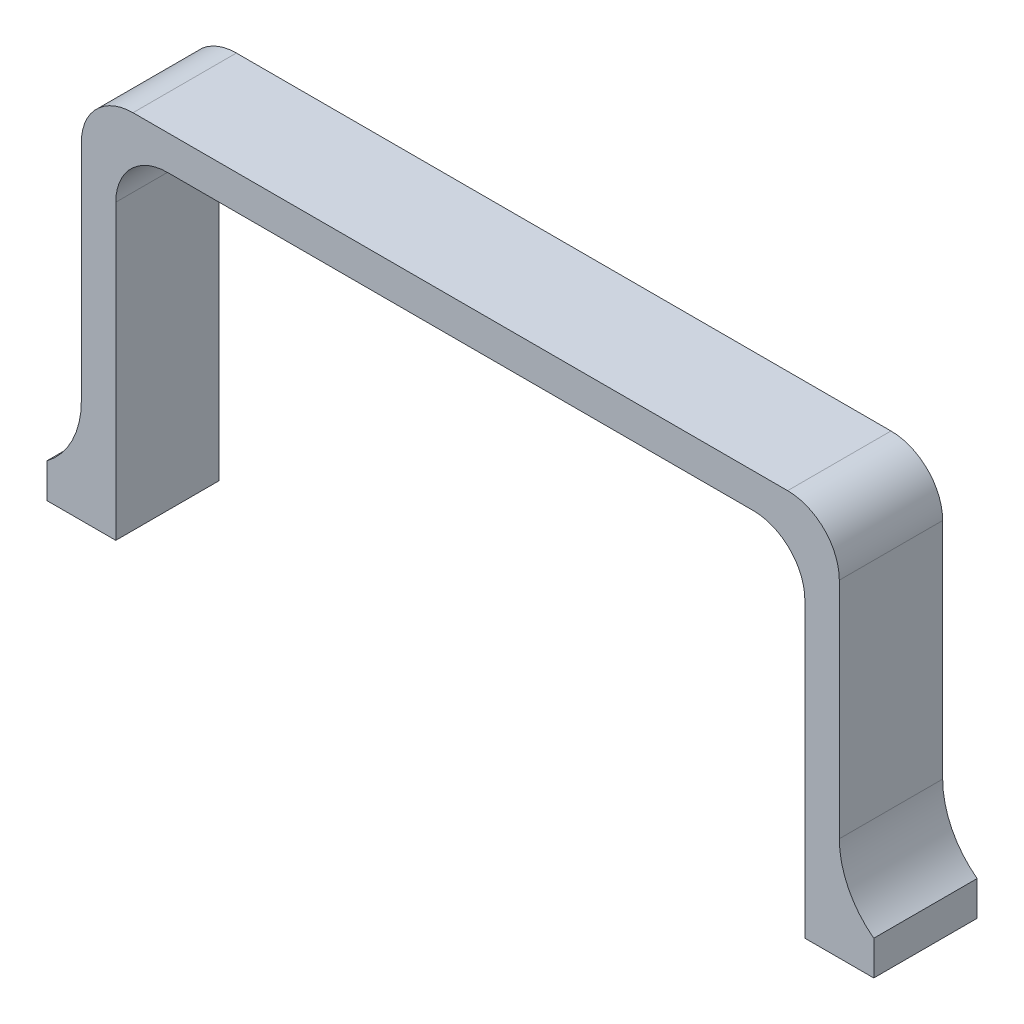
ISO-10303-21;
HEADER;
FILE_DESCRIPTION(('STEP AP214'),'2;1');
FILE_NAME('part.step','',(''),(''),'','','');
FILE_SCHEMA(('AUTOMOTIVE_DESIGN { 1 0 10303 214 1 1 1 1 }'));
ENDSEC;
DATA;
#1=APPLICATION_CONTEXT('core data for automotive mechanical design processes');
#2=APPLICATION_PROTOCOL_DEFINITION('international standard','automotive_design',2000,#1);
#3=PRODUCT_CONTEXT('',#1,'mechanical');
#4=PRODUCT('Part','Part','',(#3));
#5=PRODUCT_RELATED_PRODUCT_CATEGORY('part','',(#4));
#6=PRODUCT_DEFINITION_FORMATION('','',#4);
#7=PRODUCT_DEFINITION_CONTEXT('part definition',#1,'design');
#8=PRODUCT_DEFINITION('design','',#6,#7);
#9=PRODUCT_DEFINITION_SHAPE('','',#8);
#10=(LENGTH_UNIT() NAMED_UNIT(*) SI_UNIT(.MILLI.,.METRE.));
#11=(NAMED_UNIT(*) PLANE_ANGLE_UNIT() SI_UNIT($,.RADIAN.));
#12=(NAMED_UNIT(*) SI_UNIT($,.STERADIAN.) SOLID_ANGLE_UNIT());
#13=UNCERTAINTY_MEASURE_WITH_UNIT(LENGTH_MEASURE(1.E-05),#10,'distance_accuracy_value','');
#14=(GEOMETRIC_REPRESENTATION_CONTEXT(3) GLOBAL_UNCERTAINTY_ASSIGNED_CONTEXT((#13)) GLOBAL_UNIT_ASSIGNED_CONTEXT((#10,
#11,#12)) REPRESENTATION_CONTEXT('',''));
#15=CARTESIAN_POINT('',(0.,0.,0.));
#16=DIRECTION('',(0.,0.,1.));
#17=DIRECTION('',(1.,0.,0.));
#18=AXIS2_PLACEMENT_3D('',#15,#16,#17);
#19=CARTESIAN_POINT('',(20.,0.,6.));
#20=DIRECTION('',(1.,0.,0.));
#21=DIRECTION('',(0.,1.,0.));
#22=AXIS2_PLACEMENT_3D('',#19,#20,#21);
#23=PLANE('',#22);
#24=DIRECTION('',(0.,-1.,0.));
#25=VECTOR('',#24,1.);
#26=CARTESIAN_POINT('',(20.,0.,6.));
#27=LINE('',#26,#25);
#28=CARTESIAN_POINT('',(20.,-3.,6.));
#29=VERTEX_POINT('',#28);
#30=CARTESIAN_POINT('',(20.,-20.,6.));
#31=VERTEX_POINT('',#30);
#32=EDGE_CURVE('E150',#29,#31,#27,.T.);
#33=ORIENTED_EDGE('',*,*,#32,.F.);
#34=DIRECTION('',(0.,0.,-1.));
#35=VECTOR('',#34,1.);
#36=CARTESIAN_POINT('',(20.,-3.,0.));
#37=LINE('',#36,#35);
#38=CARTESIAN_POINT('',(20.,-3.,0.));
#39=VERTEX_POINT('',#38);
#40=EDGE_CURVE('E228',#29,#39,#37,.T.);
#41=ORIENTED_EDGE('',*,*,#40,.T.);
#42=DIRECTION('',(0.,-1.,0.));
#43=VECTOR('',#42,1.);
#44=CARTESIAN_POINT('',(20.,0.,0.));
#45=LINE('',#44,#43);
#46=CARTESIAN_POINT('',(20.,-20.,0.));
#47=VERTEX_POINT('',#46);
#48=EDGE_CURVE('E176',#39,#47,#45,.T.);
#49=ORIENTED_EDGE('',*,*,#48,.T.);
#50=DIRECTION('',(0.,0.,-1.));
#51=VECTOR('',#50,1.);
#52=CARTESIAN_POINT('',(20.,-20.,6.));
#53=LINE('',#52,#51);
#54=EDGE_CURVE('E168',#31,#47,#53,.T.);
#55=ORIENTED_EDGE('',*,*,#54,.F.);
#56=EDGE_LOOP('',(#33,#41,#49,#55));
#57=FACE_BOUND('',#56,.T.);
#58=ADVANCED_FACE('F38',(#57),#23,.F.);
#59=CARTESIAN_POINT('',(20.,-20.,6.));
#60=DIRECTION('',(0.,1.,0.));
#61=DIRECTION('',(0.,0.,1.));
#62=AXIS2_PLACEMENT_3D('',#59,#60,#61);
#63=PLANE('',#62);
#64=DIRECTION('',(1.,0.,0.));
#65=VECTOR('',#64,1.);
#66=CARTESIAN_POINT('',(20.,-20.,0.));
#67=LINE('',#66,#65);
#68=CARTESIAN_POINT('',(24.,-20.,0.));
#69=VERTEX_POINT('',#68);
#70=EDGE_CURVE('E285',#47,#69,#67,.T.);
#71=ORIENTED_EDGE('',*,*,#70,.T.);
#72=DIRECTION('',(0.,0.,-1.));
#73=VECTOR('',#72,1.);
#74=CARTESIAN_POINT('',(24.,-20.,6.));
#75=LINE('',#74,#73);
#76=CARTESIAN_POINT('',(24.,-20.,6.));
#77=VERTEX_POINT('',#76);
#78=EDGE_CURVE('E170',#77,#69,#75,.T.);
#79=ORIENTED_EDGE('',*,*,#78,.F.);
#80=DIRECTION('',(1.,0.,0.));
#81=VECTOR('',#80,1.);
#82=CARTESIAN_POINT('',(20.,-20.,6.));
#83=LINE('',#82,#81);
#84=EDGE_CURVE('E154',#31,#77,#83,.T.);
#85=ORIENTED_EDGE('',*,*,#84,.F.);
#86=ORIENTED_EDGE('',*,*,#54,.T.);
#87=EDGE_LOOP('',(#71,#79,#85,#86));
#88=FACE_BOUND('',#87,.T.);
#89=ADVANCED_FACE('F167',(#88),#63,.F.);
#90=CARTESIAN_POINT('',(24.,-20.,6.));
#91=DIRECTION('',(-1.,0.,0.));
#92=DIRECTION('',(0.,0.,1.));
#93=AXIS2_PLACEMENT_3D('',#90,#91,#92);
#94=PLANE('',#93);
#95=DIRECTION('',(0.,1.,0.));
#96=VECTOR('',#95,1.);
#97=CARTESIAN_POINT('',(24.,-20.,0.));
#98=LINE('',#97,#96);
#99=CARTESIAN_POINT('',(24.,-18.,0.));
#100=VERTEX_POINT('',#99);
#101=EDGE_CURVE('E288',#69,#100,#98,.T.);
#102=ORIENTED_EDGE('',*,*,#101,.T.);
#103=DIRECTION('',(0.,0.,-1.));
#104=VECTOR('',#103,1.);
#105=CARTESIAN_POINT('',(24.,-18.,6.));
#106=LINE('',#105,#104);
#107=CARTESIAN_POINT('',(24.,-18.,6.));
#108=VERTEX_POINT('',#107);
#109=EDGE_CURVE('E186',#108,#100,#106,.T.);
#110=ORIENTED_EDGE('',*,*,#109,.F.);
#111=DIRECTION('',(0.,1.,0.));
#112=VECTOR('',#111,1.);
#113=CARTESIAN_POINT('',(24.,-20.,6.));
#114=LINE('',#113,#112);
#115=EDGE_CURVE('E173',#77,#108,#114,.T.);
#116=ORIENTED_EDGE('',*,*,#115,.F.);
#117=ORIENTED_EDGE('',*,*,#78,.T.);
#118=EDGE_LOOP('',(#102,#110,#116,#117));
#119=FACE_BOUND('',#118,.T.);
#120=ADVANCED_FACE('F324',(#119),#94,.F.);
#121=CARTESIAN_POINT('',(22.,-18.,6.));
#122=DIRECTION('',(-1.,0.,0.));
#123=DIRECTION('',(0.,0.,1.));
#124=AXIS2_PLACEMENT_3D('',#121,#122,#123);
#125=PLANE('',#124);
#126=DIRECTION('',(0.,1.,0.));
#127=VECTOR('',#126,1.);
#128=CARTESIAN_POINT('',(22.,-18.,0.));
#129=LINE('',#128,#127);
#130=CARTESIAN_POINT('',(22.,-14.,0.));
#131=VERTEX_POINT('',#130);
#132=CARTESIAN_POINT('',(22.,-0.999999999999997,0.));
#133=VERTEX_POINT('',#132);
#134=EDGE_CURVE('E292',#131,#133,#129,.T.);
#135=ORIENTED_EDGE('',*,*,#134,.T.);
#136=DIRECTION('',(0.,0.,-1.));
#137=VECTOR('',#136,1.);
#138=CARTESIAN_POINT('',(22.,-0.999999999999997,6.));
#139=LINE('',#138,#137);
#140=CARTESIAN_POINT('',(22.,-0.999999999999997,6.));
#141=VERTEX_POINT('',#140);
#142=EDGE_CURVE('E219',#133,#141,#139,.F.);
#143=ORIENTED_EDGE('',*,*,#142,.T.);
#144=DIRECTION('',(0.,1.,0.));
#145=VECTOR('',#144,1.);
#146=CARTESIAN_POINT('',(22.,-18.,6.));
#147=LINE('',#146,#145);
#148=CARTESIAN_POINT('',(22.,-14.,6.));
#149=VERTEX_POINT('',#148);
#150=EDGE_CURVE('E339',#149,#141,#147,.T.);
#151=ORIENTED_EDGE('',*,*,#150,.F.);
#152=DIRECTION('',(0.,0.,-1.));
#153=VECTOR('',#152,1.);
#154=CARTESIAN_POINT('',(22.,-14.,6.));
#155=LINE('',#154,#153);
#156=EDGE_CURVE('E179',#149,#131,#155,.T.);
#157=ORIENTED_EDGE('',*,*,#156,.T.);
#158=EDGE_LOOP('',(#135,#143,#151,#157));
#159=FACE_BOUND('',#158,.T.);
#160=ADVANCED_FACE('F329',(#159),#125,.F.);
#161=CARTESIAN_POINT('',(22.,2.,6.));
#162=DIRECTION('',(0.,-1.,0.));
#163=DIRECTION('',(1.,0.,0.));
#164=AXIS2_PLACEMENT_3D('',#161,#162,#163);
#165=PLANE('',#164);
#166=DIRECTION('',(-1.,0.,0.));
#167=VECTOR('',#166,1.);
#168=CARTESIAN_POINT('',(22.,2.,6.));
#169=LINE('',#168,#167);
#170=CARTESIAN_POINT('',(19.,2.,6.));
#171=VERTEX_POINT('',#170);
#172=CARTESIAN_POINT('',(-19.,2.,6.));
#173=VERTEX_POINT('',#172);
#174=EDGE_CURVE('E337',#171,#173,#169,.T.);
#175=ORIENTED_EDGE('',*,*,#174,.F.);
#176=DIRECTION('',(0.,0.,-1.));
#177=VECTOR('',#176,1.);
#178=CARTESIAN_POINT('',(19.,2.,6.));
#179=LINE('',#178,#177);
#180=CARTESIAN_POINT('',(19.,2.,0.));
#181=VERTEX_POINT('',#180);
#182=EDGE_CURVE('E209',#171,#181,#179,.T.);
#183=ORIENTED_EDGE('',*,*,#182,.T.);
#184=DIRECTION('',(-1.,0.,0.));
#185=VECTOR('',#184,1.);
#186=CARTESIAN_POINT('',(22.,2.,0.));
#187=LINE('',#186,#185);
#188=CARTESIAN_POINT('',(-19.,2.,0.));
#189=VERTEX_POINT('',#188);
#190=EDGE_CURVE('E296',#181,#189,#187,.T.);
#191=ORIENTED_EDGE('',*,*,#190,.T.);
#192=DIRECTION('',(0.,0.,-1.));
#193=VECTOR('',#192,1.);
#194=CARTESIAN_POINT('',(-19.,2.,6.));
#195=LINE('',#194,#193);
#196=EDGE_CURVE('E206',#189,#173,#195,.F.);
#197=ORIENTED_EDGE('',*,*,#196,.T.);
#198=EDGE_LOOP('',(#175,#183,#191,#197));
#199=FACE_BOUND('',#198,.T.);
#200=ADVANCED_FACE('F341',(#199),#165,.F.);
#201=CARTESIAN_POINT('',(-22.,-18.,6.));
#202=DIRECTION('',(1.,0.,0.));
#203=DIRECTION('',(0.,1.,0.));
#204=AXIS2_PLACEMENT_3D('',#201,#202,#203);
#205=PLANE('',#204);
#206=DIRECTION('',(0.,-1.,0.));
#207=VECTOR('',#206,1.);
#208=CARTESIAN_POINT('',(-22.,-18.,6.));
#209=LINE('',#208,#207);
#210=CARTESIAN_POINT('',(-22.,-1.,6.));
#211=VERTEX_POINT('',#210);
#212=CARTESIAN_POINT('',(-22.,-14.,6.));
#213=VERTEX_POINT('',#212);
#214=EDGE_CURVE('E344',#211,#213,#209,.T.);
#215=ORIENTED_EDGE('',*,*,#214,.F.);
#216=DIRECTION('',(0.,0.,-1.));
#217=VECTOR('',#216,1.);
#218=CARTESIAN_POINT('',(-22.,-1.,6.));
#219=LINE('',#218,#217);
#220=CARTESIAN_POINT('',(-22.,-1.,0.));
#221=VERTEX_POINT('',#220);
#222=EDGE_CURVE('E240',#211,#221,#219,.T.);
#223=ORIENTED_EDGE('',*,*,#222,.T.);
#224=DIRECTION('',(0.,-1.,0.));
#225=VECTOR('',#224,1.);
#226=CARTESIAN_POINT('',(-22.,-18.,0.));
#227=LINE('',#226,#225);
#228=CARTESIAN_POINT('',(-22.,-14.,0.));
#229=VERTEX_POINT('',#228);
#230=EDGE_CURVE('E300',#221,#229,#227,.T.);
#231=ORIENTED_EDGE('',*,*,#230,.T.);
#232=DIRECTION('',(0.,0.,1.));
#233=VECTOR('',#232,1.);
#234=CARTESIAN_POINT('',(-22.,-14.,6.));
#235=LINE('',#234,#233);
#236=EDGE_CURVE('E184',#229,#213,#235,.T.);
#237=ORIENTED_EDGE('',*,*,#236,.T.);
#238=EDGE_LOOP('',(#215,#223,#231,#237));
#239=FACE_BOUND('',#238,.T.);
#240=ADVANCED_FACE('F371',(#239),#205,.F.);
#241=CARTESIAN_POINT('',(-24.,-20.,6.));
#242=DIRECTION('',(1.,0.,0.));
#243=DIRECTION('',(0.,0.,-1.));
#244=AXIS2_PLACEMENT_3D('',#241,#242,#243);
#245=PLANE('',#244);
#246=DIRECTION('',(0.,-1.,0.));
#247=VECTOR('',#246,1.);
#248=CARTESIAN_POINT('',(-24.,-20.,0.));
#249=LINE('',#248,#247);
#250=CARTESIAN_POINT('',(-24.,-18.,0.));
#251=VERTEX_POINT('',#250);
#252=CARTESIAN_POINT('',(-24.,-20.,0.));
#253=VERTEX_POINT('',#252);
#254=EDGE_CURVE('E303',#251,#253,#249,.T.);
#255=ORIENTED_EDGE('',*,*,#254,.T.);
#256=DIRECTION('',(0.,0.,-1.));
#257=VECTOR('',#256,1.);
#258=CARTESIAN_POINT('',(-24.,-20.,6.));
#259=LINE('',#258,#257);
#260=CARTESIAN_POINT('',(-24.,-20.,6.));
#261=VERTEX_POINT('',#260);
#262=EDGE_CURVE('E277',#261,#253,#259,.T.);
#263=ORIENTED_EDGE('',*,*,#262,.F.);
#264=DIRECTION('',(0.,-1.,0.));
#265=VECTOR('',#264,1.);
#266=CARTESIAN_POINT('',(-24.,-20.,6.));
#267=LINE('',#266,#265);
#268=CARTESIAN_POINT('',(-24.,-18.,6.));
#269=VERTEX_POINT('',#268);
#270=EDGE_CURVE('E348',#269,#261,#267,.T.);
#271=ORIENTED_EDGE('',*,*,#270,.F.);
#272=DIRECTION('',(0.,0.,-1.));
#273=VECTOR('',#272,1.);
#274=CARTESIAN_POINT('',(-24.,-18.,6.));
#275=LINE('',#274,#273);
#276=EDGE_CURVE('E313',#269,#251,#275,.T.);
#277=ORIENTED_EDGE('',*,*,#276,.T.);
#278=EDGE_LOOP('',(#255,#263,#271,#277));
#279=FACE_BOUND('',#278,.T.);
#280=ADVANCED_FACE('F364',(#279),#245,.F.);
#281=CARTESIAN_POINT('',(-20.,-20.,6.));
#282=DIRECTION('',(0.,1.,0.));
#283=DIRECTION('',(-1.,0.,0.));
#284=AXIS2_PLACEMENT_3D('',#281,#282,#283);
#285=PLANE('',#284);
#286=DIRECTION('',(1.,0.,0.));
#287=VECTOR('',#286,1.);
#288=CARTESIAN_POINT('',(-20.,-20.,0.));
#289=LINE('',#288,#287);
#290=CARTESIAN_POINT('',(-20.,-20.,0.));
#291=VERTEX_POINT('',#290);
#292=EDGE_CURVE('E267',#253,#291,#289,.T.);
#293=ORIENTED_EDGE('',*,*,#292,.T.);
#294=DIRECTION('',(0.,0.,-1.));
#295=VECTOR('',#294,1.);
#296=CARTESIAN_POINT('',(-20.,-20.,6.));
#297=LINE('',#296,#295);
#298=CARTESIAN_POINT('',(-20.,-20.,6.));
#299=VERTEX_POINT('',#298);
#300=EDGE_CURVE('E265',#299,#291,#297,.T.);
#301=ORIENTED_EDGE('',*,*,#300,.F.);
#302=DIRECTION('',(1.,0.,0.));
#303=VECTOR('',#302,1.);
#304=CARTESIAN_POINT('',(-20.,-20.,6.));
#305=LINE('',#304,#303);
#306=EDGE_CURVE('E279',#261,#299,#305,.T.);
#307=ORIENTED_EDGE('',*,*,#306,.F.);
#308=ORIENTED_EDGE('',*,*,#262,.T.);
#309=EDGE_LOOP('',(#293,#301,#307,#308));
#310=FACE_BOUND('',#309,.T.);
#311=ADVANCED_FACE('F359',(#310),#285,.F.);
#312=CARTESIAN_POINT('',(-20.,0.,6.));
#313=DIRECTION('',(-1.,0.,0.));
#314=DIRECTION('',(0.,-1.,0.));
#315=AXIS2_PLACEMENT_3D('',#312,#313,#314);
#316=PLANE('',#315);
#317=DIRECTION('',(0.,1.,0.));
#318=VECTOR('',#317,1.);
#319=CARTESIAN_POINT('',(-20.,0.,0.));
#320=LINE('',#319,#318);
#321=CARTESIAN_POINT('',(-20.,-3.,0.));
#322=VERTEX_POINT('',#321);
#323=EDGE_CURVE('E256',#291,#322,#320,.T.);
#324=ORIENTED_EDGE('',*,*,#323,.T.);
#325=DIRECTION('',(0.,0.,-1.));
#326=VECTOR('',#325,1.);
#327=CARTESIAN_POINT('',(-20.,-3.,6.));
#328=LINE('',#327,#326);
#329=CARTESIAN_POINT('',(-20.,-3.,6.));
#330=VERTEX_POINT('',#329);
#331=EDGE_CURVE('E237',#322,#330,#328,.F.);
#332=ORIENTED_EDGE('',*,*,#331,.T.);
#333=DIRECTION('',(0.,1.,0.));
#334=VECTOR('',#333,1.);
#335=CARTESIAN_POINT('',(-20.,0.,6.));
#336=LINE('',#335,#334);
#337=EDGE_CURVE('E273',#299,#330,#336,.T.);
#338=ORIENTED_EDGE('',*,*,#337,.F.);
#339=ORIENTED_EDGE('',*,*,#300,.T.);
#340=EDGE_LOOP('',(#324,#332,#338,#339));
#341=FACE_BOUND('',#340,.T.);
#342=ADVANCED_FACE('F262',(#341),#316,.F.);
#343=CARTESIAN_POINT('',(-20.,0.,6.));
#344=DIRECTION('',(0.,1.,0.));
#345=DIRECTION('',(0.,0.,1.));
#346=AXIS2_PLACEMENT_3D('',#343,#344,#345);
#347=PLANE('',#346);
#348=DIRECTION('',(1.,0.,0.));
#349=VECTOR('',#348,1.);
#350=CARTESIAN_POINT('',(-20.,0.,0.));
#351=LINE('',#350,#349);
#352=CARTESIAN_POINT('',(-17.,0.,0.));
#353=VERTEX_POINT('',#352);
#354=CARTESIAN_POINT('',(17.,0.,0.));
#355=VERTEX_POINT('',#354);
#356=EDGE_CURVE('E163',#353,#355,#351,.T.);
#357=ORIENTED_EDGE('',*,*,#356,.T.);
#358=DIRECTION('',(0.,0.,-1.));
#359=VECTOR('',#358,1.);
#360=CARTESIAN_POINT('',(17.,0.,6.));
#361=LINE('',#360,#359);
#362=CARTESIAN_POINT('',(17.,0.,6.));
#363=VERTEX_POINT('',#362);
#364=EDGE_CURVE('E54',#355,#363,#361,.F.);
#365=ORIENTED_EDGE('',*,*,#364,.T.);
#366=DIRECTION('',(1.,0.,0.));
#367=VECTOR('',#366,1.);
#368=CARTESIAN_POINT('',(-20.,0.,6.));
#369=LINE('',#368,#367);
#370=CARTESIAN_POINT('',(-17.,0.,6.));
#371=VERTEX_POINT('',#370);
#372=EDGE_CURVE('E271',#371,#363,#369,.T.);
#373=ORIENTED_EDGE('',*,*,#372,.F.);
#374=DIRECTION('',(0.,0.,-1.));
#375=VECTOR('',#374,1.);
#376=CARTESIAN_POINT('',(-17.,0.,0.));
#377=LINE('',#376,#375);
#378=EDGE_CURVE('E231',#371,#353,#377,.T.);
#379=ORIENTED_EDGE('',*,*,#378,.T.);
#380=EDGE_LOOP('',(#357,#365,#373,#379));
#381=FACE_BOUND('',#380,.T.);
#382=ADVANCED_FACE('F270',(#381),#347,.F.);
#383=CARTESIAN_POINT('',(0.,0.,6.));
#384=DIRECTION('',(0.,0.,1.));
#385=DIRECTION('',(1.,0.,0.));
#386=AXIS2_PLACEMENT_3D('',#383,#384,#385);
#387=PLANE('',#386);
#388=ORIENTED_EDGE('',*,*,#150,.T.);
#389=CARTESIAN_POINT('',(19.,-0.999999999999999,6.));
#390=DIRECTION('',(0.,0.,1.));
#391=DIRECTION('',(1.,0.,0.));
#392=AXIS2_PLACEMENT_3D('',#389,#390,#391);
#393=CIRCLE('',#392,3.);
#394=EDGE_CURVE('E225',#141,#171,#393,.T.);
#395=ORIENTED_EDGE('',*,*,#394,.T.);
#396=ORIENTED_EDGE('',*,*,#174,.T.);
#397=CARTESIAN_POINT('',(-19.,-1.,6.));
#398=DIRECTION('',(0.,0.,1.));
#399=DIRECTION('',(1.,0.,0.));
#400=AXIS2_PLACEMENT_3D('',#397,#398,#399);
#401=CIRCLE('',#400,3.);
#402=EDGE_CURVE('E222',#173,#211,#401,.T.);
#403=ORIENTED_EDGE('',*,*,#402,.T.);
#404=ORIENTED_EDGE('',*,*,#214,.T.);
#405=CARTESIAN_POINT('',(-27.,-14.,6.));
#406=DIRECTION('',(0.,0.,1.));
#407=DIRECTION('',(1.,0.,0.));
#408=AXIS2_PLACEMENT_3D('',#405,#406,#407);
#409=CIRCLE('',#408,5.);
#410=EDGE_CURVE('E203',#213,#269,#409,.F.);
#411=ORIENTED_EDGE('',*,*,#410,.T.);
#412=ORIENTED_EDGE('',*,*,#270,.T.);
#413=ORIENTED_EDGE('',*,*,#306,.T.);
#414=ORIENTED_EDGE('',*,*,#337,.T.);
#415=CARTESIAN_POINT('',(-17.,-3.,6.));
#416=DIRECTION('',(0.,0.,1.));
#417=DIRECTION('',(1.,0.,0.));
#418=AXIS2_PLACEMENT_3D('',#415,#416,#417);
#419=CIRCLE('',#418,3.);
#420=EDGE_CURVE('E11',#330,#371,#419,.F.);
#421=ORIENTED_EDGE('',*,*,#420,.T.);
#422=ORIENTED_EDGE('',*,*,#372,.T.);
#423=CARTESIAN_POINT('',(17.,-3.,6.));
#424=DIRECTION('',(0.,0.,1.));
#425=DIRECTION('',(1.,0.,0.));
#426=AXIS2_PLACEMENT_3D('',#423,#424,#425);
#427=CIRCLE('',#426,3.);
#428=EDGE_CURVE('E157',#363,#29,#427,.F.);
#429=ORIENTED_EDGE('',*,*,#428,.T.);
#430=ORIENTED_EDGE('',*,*,#32,.T.);
#431=ORIENTED_EDGE('',*,*,#84,.T.);
#432=ORIENTED_EDGE('',*,*,#115,.T.);
#433=CARTESIAN_POINT('',(27.,-14.,6.));
#434=DIRECTION('',(0.,0.,1.));
#435=DIRECTION('',(1.,0.,0.));
#436=AXIS2_PLACEMENT_3D('',#433,#434,#435);
#437=CIRCLE('',#436,5.);
#438=EDGE_CURVE('E196',#108,#149,#437,.F.);
#439=ORIENTED_EDGE('',*,*,#438,.T.);
#440=EDGE_LOOP('',(#388,#395,#396,#403,#404,#411,#412,#413,#414,#421,#422,#429,#430,#431,#432,#439));
#441=FACE_BOUND('',#440,.T.);
#442=ADVANCED_FACE('F153',(#441),#387,.T.);
#443=CARTESIAN_POINT('',(0.,0.,0.));
#444=DIRECTION('',(0.,0.,1.));
#445=DIRECTION('',(1.,0.,0.));
#446=AXIS2_PLACEMENT_3D('',#443,#444,#445);
#447=PLANE('',#446);
#448=ORIENTED_EDGE('',*,*,#190,.F.);
#449=CARTESIAN_POINT('',(19.,-0.999999999999999,0.));
#450=DIRECTION('',(0.,0.,1.));
#451=DIRECTION('',(1.,0.,0.));
#452=AXIS2_PLACEMENT_3D('',#449,#450,#451);
#453=CIRCLE('',#452,3.);
#454=EDGE_CURVE('E216',#181,#133,#453,.F.);
#455=ORIENTED_EDGE('',*,*,#454,.T.);
#456=ORIENTED_EDGE('',*,*,#134,.F.);
#457=CARTESIAN_POINT('',(27.,-14.,0.));
#458=DIRECTION('',(0.,0.,1.));
#459=DIRECTION('',(1.,0.,0.));
#460=AXIS2_PLACEMENT_3D('',#457,#458,#459);
#461=CIRCLE('',#460,5.);
#462=EDGE_CURVE('E193',#131,#100,#461,.T.);
#463=ORIENTED_EDGE('',*,*,#462,.T.);
#464=ORIENTED_EDGE('',*,*,#101,.F.);
#465=ORIENTED_EDGE('',*,*,#70,.F.);
#466=ORIENTED_EDGE('',*,*,#48,.F.);
#467=CARTESIAN_POINT('',(17.,-3.,0.));
#468=DIRECTION('',(0.,0.,1.));
#469=DIRECTION('',(1.,0.,0.));
#470=AXIS2_PLACEMENT_3D('',#467,#468,#469);
#471=CIRCLE('',#470,3.);
#472=EDGE_CURVE('E244',#39,#355,#471,.T.);
#473=ORIENTED_EDGE('',*,*,#472,.T.);
#474=ORIENTED_EDGE('',*,*,#356,.F.);
#475=CARTESIAN_POINT('',(-17.,-3.,0.));
#476=DIRECTION('',(0.,0.,1.));
#477=DIRECTION('',(1.,0.,0.));
#478=AXIS2_PLACEMENT_3D('',#475,#476,#477);
#479=CIRCLE('',#478,3.);
#480=EDGE_CURVE('E47',#353,#322,#479,.T.);
#481=ORIENTED_EDGE('',*,*,#480,.T.);
#482=ORIENTED_EDGE('',*,*,#323,.F.);
#483=ORIENTED_EDGE('',*,*,#292,.F.);
#484=ORIENTED_EDGE('',*,*,#254,.F.);
#485=CARTESIAN_POINT('',(-27.,-14.,0.));
#486=DIRECTION('',(0.,0.,1.));
#487=DIRECTION('',(1.,0.,0.));
#488=AXIS2_PLACEMENT_3D('',#485,#486,#487);
#489=CIRCLE('',#488,5.);
#490=EDGE_CURVE('E199',#251,#229,#489,.T.);
#491=ORIENTED_EDGE('',*,*,#490,.T.);
#492=ORIENTED_EDGE('',*,*,#230,.F.);
#493=CARTESIAN_POINT('',(-19.,-1.,0.));
#494=DIRECTION('',(0.,0.,1.));
#495=DIRECTION('',(1.,0.,0.));
#496=AXIS2_PLACEMENT_3D('',#493,#494,#495);
#497=CIRCLE('',#496,3.);
#498=EDGE_CURVE('E213',#221,#189,#497,.F.);
#499=ORIENTED_EDGE('',*,*,#498,.T.);
#500=EDGE_LOOP('',(#448,#455,#456,#463,#464,#465,#466,#473,#474,#481,#482,#483,#484,#491,#492,#499));
#501=FACE_BOUND('',#500,.T.);
#502=ADVANCED_FACE('F254',(#501),#447,.F.);
#503=CARTESIAN_POINT('',(27.,-14.,6.));
#504=DIRECTION('',(0.,0.,-1.));
#505=DIRECTION('',(-1.,0.,0.));
#506=AXIS2_PLACEMENT_3D('',#503,#504,#505);
#507=CYLINDRICAL_SURFACE('',#506,5.);
#508=ORIENTED_EDGE('',*,*,#438,.F.);
#509=ORIENTED_EDGE('',*,*,#109,.T.);
#510=ORIENTED_EDGE('',*,*,#462,.F.);
#511=ORIENTED_EDGE('',*,*,#156,.F.);
#512=EDGE_LOOP('',(#508,#509,#510,#511));
#513=FACE_BOUND('',#512,.T.);
#514=ADVANCED_FACE('F321',(#513),#507,.F.);
#515=CARTESIAN_POINT('',(-27.,-14.,6.));
#516=DIRECTION('',(0.,0.,1.));
#517=DIRECTION('',(1.,0.,0.));
#518=AXIS2_PLACEMENT_3D('',#515,#516,#517);
#519=CYLINDRICAL_SURFACE('',#518,5.);
#520=ORIENTED_EDGE('',*,*,#410,.F.);
#521=ORIENTED_EDGE('',*,*,#236,.F.);
#522=ORIENTED_EDGE('',*,*,#490,.F.);
#523=ORIENTED_EDGE('',*,*,#276,.F.);
#524=EDGE_LOOP('',(#520,#521,#522,#523));
#525=FACE_BOUND('',#524,.T.);
#526=ADVANCED_FACE('F368',(#525),#519,.F.);
#527=CARTESIAN_POINT('',(19.,-0.999999999999999,6.));
#528=DIRECTION('',(0.,0.,-1.));
#529=DIRECTION('',(-1.,0.,0.));
#530=AXIS2_PLACEMENT_3D('',#527,#528,#529);
#531=CYLINDRICAL_SURFACE('',#530,3.);
#532=ORIENTED_EDGE('',*,*,#394,.F.);
#533=ORIENTED_EDGE('',*,*,#142,.F.);
#534=ORIENTED_EDGE('',*,*,#454,.F.);
#535=ORIENTED_EDGE('',*,*,#182,.F.);
#536=EDGE_LOOP('',(#532,#533,#534,#535));
#537=FACE_BOUND('',#536,.T.);
#538=ADVANCED_FACE('F333',(#537),#531,.T.);
#539=CARTESIAN_POINT('',(17.,-3.,6.));
#540=DIRECTION('',(0.,0.,1.));
#541=DIRECTION('',(1.,0.,0.));
#542=AXIS2_PLACEMENT_3D('',#539,#540,#541);
#543=CYLINDRICAL_SURFACE('',#542,3.);
#544=ORIENTED_EDGE('',*,*,#428,.F.);
#545=ORIENTED_EDGE('',*,*,#364,.F.);
#546=ORIENTED_EDGE('',*,*,#472,.F.);
#547=ORIENTED_EDGE('',*,*,#40,.F.);
#548=EDGE_LOOP('',(#544,#545,#546,#547));
#549=FACE_BOUND('',#548,.T.);
#550=ADVANCED_FACE('F378',(#549),#543,.F.);
#551=CARTESIAN_POINT('',(-17.,-3.,6.));
#552=DIRECTION('',(0.,0.,1.));
#553=DIRECTION('',(1.,0.,0.));
#554=AXIS2_PLACEMENT_3D('',#551,#552,#553);
#555=CYLINDRICAL_SURFACE('',#554,3.);
#556=ORIENTED_EDGE('',*,*,#420,.F.);
#557=ORIENTED_EDGE('',*,*,#331,.F.);
#558=ORIENTED_EDGE('',*,*,#480,.F.);
#559=ORIENTED_EDGE('',*,*,#378,.F.);
#560=EDGE_LOOP('',(#556,#557,#558,#559));
#561=FACE_BOUND('',#560,.T.);
#562=ADVANCED_FACE('F269',(#561),#555,.F.);
#563=CARTESIAN_POINT('',(-19.,-1.,6.));
#564=DIRECTION('',(0.,0.,-1.));
#565=DIRECTION('',(-1.,0.,0.));
#566=AXIS2_PLACEMENT_3D('',#563,#564,#565);
#567=CYLINDRICAL_SURFACE('',#566,3.);
#568=ORIENTED_EDGE('',*,*,#402,.F.);
#569=ORIENTED_EDGE('',*,*,#196,.F.);
#570=ORIENTED_EDGE('',*,*,#498,.F.);
#571=ORIENTED_EDGE('',*,*,#222,.F.);
#572=EDGE_LOOP('',(#568,#569,#570,#571));
#573=FACE_BOUND('',#572,.T.);
#574=ADVANCED_FACE('F40',(#573),#567,.T.);
#575=CLOSED_SHELL('',(#58,#89,#120,#160,#200,#240,#280,#311,#342,#382,#442,#502,#514,#526,#538,
#550,#562,#574));
#576=MANIFOLD_SOLID_BREP('B2',#575);
#577=ADVANCED_BREP_SHAPE_REPRESENTATION('',(#18,#576),#14);
#578=SHAPE_DEFINITION_REPRESENTATION(#9,#577);
ENDSEC;
END-ISO-10303-21;
